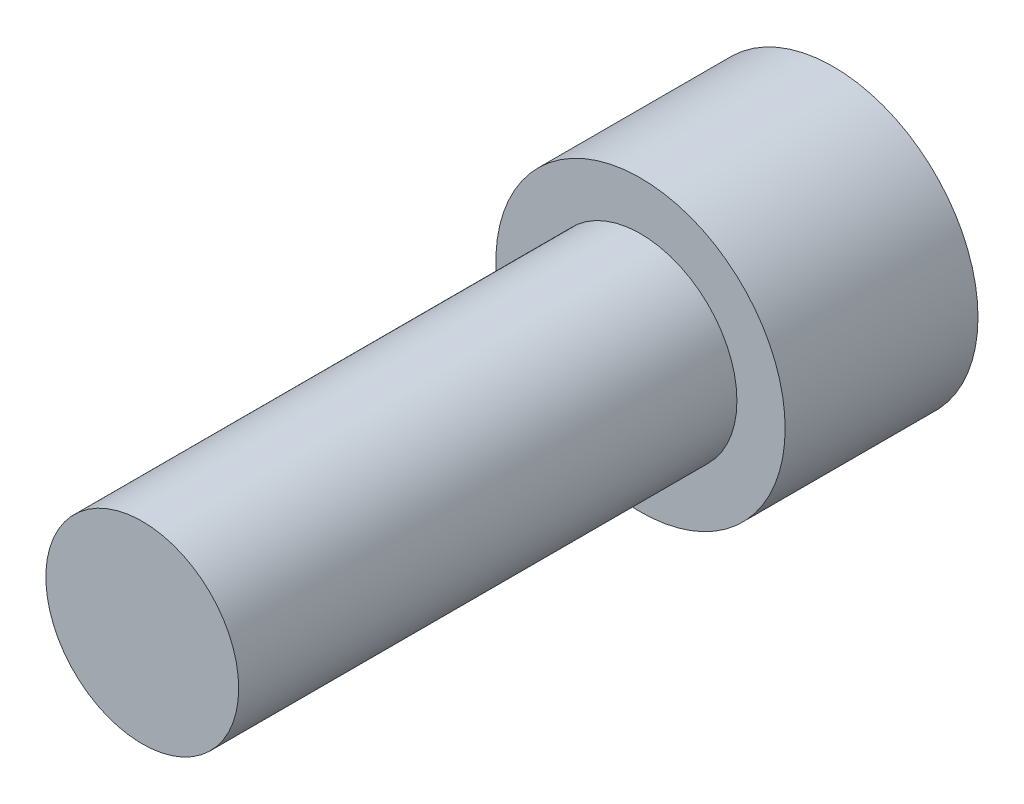
ISO-10303-21;
HEADER;
FILE_DESCRIPTION(('STEP AP214'),'2;1');
FILE_NAME('part.step','',(''),(''),'','','');
FILE_SCHEMA(('AUTOMOTIVE_DESIGN { 1 0 10303 214 1 1 1 1 }'));
ENDSEC;
DATA;
#1=APPLICATION_CONTEXT('core data for automotive mechanical design processes');
#2=APPLICATION_PROTOCOL_DEFINITION('international standard','automotive_design',2000,#1);
#3=PRODUCT_CONTEXT('',#1,'mechanical');
#4=PRODUCT('Part','Part','',(#3));
#5=PRODUCT_RELATED_PRODUCT_CATEGORY('part','',(#4));
#6=PRODUCT_DEFINITION_FORMATION('','',#4);
#7=PRODUCT_DEFINITION_CONTEXT('part definition',#1,'design');
#8=PRODUCT_DEFINITION('design','',#6,#7);
#9=PRODUCT_DEFINITION_SHAPE('','',#8);
#10=(LENGTH_UNIT() NAMED_UNIT(*) SI_UNIT(.MILLI.,.METRE.));
#11=(NAMED_UNIT(*) PLANE_ANGLE_UNIT() SI_UNIT($,.RADIAN.));
#12=(NAMED_UNIT(*) SI_UNIT($,.STERADIAN.) SOLID_ANGLE_UNIT());
#13=UNCERTAINTY_MEASURE_WITH_UNIT(LENGTH_MEASURE(1.E-05),#10,'distance_accuracy_value','');
#14=(GEOMETRIC_REPRESENTATION_CONTEXT(3) GLOBAL_UNCERTAINTY_ASSIGNED_CONTEXT((#13)) GLOBAL_UNIT_ASSIGNED_CONTEXT((#10,
#11,#12)) REPRESENTATION_CONTEXT('',''));
#15=CARTESIAN_POINT('',(0.,0.,0.));
#16=DIRECTION('',(0.,0.,1.));
#17=DIRECTION('',(1.,0.,0.));
#18=AXIS2_PLACEMENT_3D('',#15,#16,#17);
#19=CARTESIAN_POINT('',(0.,0.,12.));
#20=DIRECTION('',(0.,0.,1.));
#21=DIRECTION('',(1.,0.,0.));
#22=AXIS2_PLACEMENT_3D('',#19,#20,#21);
#23=PLANE('',#22);
#24=CARTESIAN_POINT('',(0.,0.,12.));
#25=DIRECTION('',(0.,0.,1.));
#26=DIRECTION('',(1.,0.,0.));
#27=AXIS2_PLACEMENT_3D('',#24,#25,#26);
#28=CIRCLE('',#27,9.);
#29=CARTESIAN_POINT('',(9.,0.,12.));
#30=VERTEX_POINT('',#29);
#31=EDGE_CURVE('E11',#30,#30,#28,.T.);
#32=ORIENTED_EDGE('',*,*,#31,.T.);
#33=EDGE_LOOP('',(#32));
#34=FACE_BOUND('',#33,.T.);
#35=CARTESIAN_POINT('',(0.,0.,12.));
#36=DIRECTION('',(0.,0.,1.));
#37=DIRECTION('',(1.,0.,0.));
#38=AXIS2_PLACEMENT_3D('',#35,#36,#37);
#39=CIRCLE('',#38,6.);
#40=CARTESIAN_POINT('',(6.,0.,12.));
#41=VERTEX_POINT('',#40);
#42=EDGE_CURVE('E139',#41,#41,#39,.T.);
#43=ORIENTED_EDGE('',*,*,#42,.F.);
#44=EDGE_LOOP('',(#43));
#45=FACE_BOUND('',#44,.T.);
#46=ADVANCED_FACE('F37',(#34,#45),#23,.T.);
#47=CARTESIAN_POINT('',(0.,0.,12.));
#48=DIRECTION('',(0.,0.,-1.));
#49=DIRECTION('',(-1.,0.,0.));
#50=AXIS2_PLACEMENT_3D('',#47,#48,#49);
#51=CYLINDRICAL_SURFACE('',#50,9.);
#52=ORIENTED_EDGE('',*,*,#31,.F.);
#53=EDGE_LOOP('',(#52));
#54=FACE_BOUND('',#53,.T.);
#55=CARTESIAN_POINT('',(0.,0.,0.));
#56=DIRECTION('',(0.,0.,1.));
#57=DIRECTION('',(1.,0.,0.));
#58=AXIS2_PLACEMENT_3D('',#55,#56,#57);
#59=CIRCLE('',#58,9.);
#60=CARTESIAN_POINT('',(9.,0.,0.));
#61=VERTEX_POINT('',#60);
#62=EDGE_CURVE('E41',#61,#61,#59,.T.);
#63=ORIENTED_EDGE('',*,*,#62,.T.);
#64=EDGE_LOOP('',(#63));
#65=FACE_BOUND('',#64,.T.);
#66=ADVANCED_FACE('F39',(#54,#65),#51,.T.);
#67=CARTESIAN_POINT('',(0.,0.,0.));
#68=DIRECTION('',(0.,0.,1.));
#69=DIRECTION('',(1.,0.,0.));
#70=AXIS2_PLACEMENT_3D('',#67,#68,#69);
#71=PLANE('',#70);
#72=DIRECTION('',(0.939506673027902,0.342530599123702,0.));
#73=VECTOR('',#72,1.);
#74=CARTESIAN_POINT('',(-5.21088849135358,4.3676326774003,0.));
#75=LINE('',#74,#73);
#76=CARTESIAN_POINT('',(-5.21088849135358,4.3676326774003,0.));
#77=VERTEX_POINT('',#76);
#78=CARTESIAN_POINT('',(1.17703660735091,6.69657814850032,0.));
#79=VERTEX_POINT('',#78);
#80=EDGE_CURVE('E126',#77,#79,#75,.T.);
#81=ORIENTED_EDGE('',*,*,#80,.F.);
#82=DIRECTION('',(0.173113136099322,0.984901945429015,0.));
#83=VECTOR('',#82,1.);
#84=CARTESIAN_POINT('',(-6.38792509870449,-2.32894547110002,0.));
#85=LINE('',#84,#83);
#86=CARTESIAN_POINT('',(-6.38792509870449,-2.32894547110002,0.));
#87=VERTEX_POINT('',#86);
#88=EDGE_CURVE('E52',#87,#77,#85,.T.);
#89=ORIENTED_EDGE('',*,*,#88,.F.);
#90=DIRECTION('',(-0.76639353692858,0.642371346305313,0.));
#91=VECTOR('',#90,1.);
#92=CARTESIAN_POINT('',(-1.17703660735091,-6.69657814850032,0.));
#93=LINE('',#92,#91);
#94=CARTESIAN_POINT('',(-1.17703660735091,-6.69657814850032,0.));
#95=VERTEX_POINT('',#94);
#96=EDGE_CURVE('E135',#95,#87,#93,.T.);
#97=ORIENTED_EDGE('',*,*,#96,.F.);
#98=DIRECTION('',(-0.939506673027902,-0.342530599123702,0.));
#99=VECTOR('',#98,1.);
#100=CARTESIAN_POINT('',(5.21088849135358,-4.3676326774003,0.));
#101=LINE('',#100,#99);
#102=CARTESIAN_POINT('',(5.21088849135358,-4.3676326774003,0.));
#103=VERTEX_POINT('',#102);
#104=EDGE_CURVE('E133',#103,#95,#101,.T.);
#105=ORIENTED_EDGE('',*,*,#104,.F.);
#106=DIRECTION('',(-0.173113136099322,-0.984901945429015,0.));
#107=VECTOR('',#106,1.);
#108=CARTESIAN_POINT('',(6.38792509870449,2.32894547110002,0.));
#109=LINE('',#108,#107);
#110=CARTESIAN_POINT('',(6.38792509870449,2.32894547110002,0.));
#111=VERTEX_POINT('',#110);
#112=EDGE_CURVE('E100',#111,#103,#109,.T.);
#113=ORIENTED_EDGE('',*,*,#112,.F.);
#114=DIRECTION('',(0.76639353692858,-0.642371346305313,0.));
#115=VECTOR('',#114,1.);
#116=CARTESIAN_POINT('',(1.17703660735091,6.69657814850032,0.));
#117=LINE('',#116,#115);
#118=EDGE_CURVE('E129',#79,#111,#117,.T.);
#119=ORIENTED_EDGE('',*,*,#118,.F.);
#120=EDGE_LOOP('',(#81,#89,#97,#105,#113,#119));
#121=FACE_BOUND('',#120,.T.);
#122=ORIENTED_EDGE('',*,*,#62,.F.);
#123=EDGE_LOOP('',(#122));
#124=FACE_BOUND('',#123,.T.);
#125=ADVANCED_FACE('F159',(#121,#124),#71,.F.);
#126=CARTESIAN_POINT('',(0.,0.,43.));
#127=DIRECTION('',(0.,0.,-1.));
#128=DIRECTION('',(-1.,0.,0.));
#129=AXIS2_PLACEMENT_3D('',#126,#127,#128);
#130=CYLINDRICAL_SURFACE('',#129,6.);
#131=CARTESIAN_POINT('',(0.,0.,43.));
#132=DIRECTION('',(0.,0.,1.));
#133=DIRECTION('',(1.,0.,0.));
#134=AXIS2_PLACEMENT_3D('',#131,#132,#133);
#135=CIRCLE('',#134,6.);
#136=CARTESIAN_POINT('',(6.,0.,43.));
#137=VERTEX_POINT('',#136);
#138=EDGE_CURVE('E145',#137,#137,#135,.T.);
#139=ORIENTED_EDGE('',*,*,#138,.F.);
#140=EDGE_LOOP('',(#139));
#141=FACE_BOUND('',#140,.T.);
#142=ORIENTED_EDGE('',*,*,#42,.T.);
#143=EDGE_LOOP('',(#142));
#144=FACE_BOUND('',#143,.T.);
#145=ADVANCED_FACE('F151',(#141,#144),#130,.T.);
#146=CARTESIAN_POINT('',(0.,0.,43.));
#147=DIRECTION('',(0.,0.,1.));
#148=DIRECTION('',(1.,0.,0.));
#149=AXIS2_PLACEMENT_3D('',#146,#147,#148);
#150=PLANE('',#149);
#151=ORIENTED_EDGE('',*,*,#138,.T.);
#152=EDGE_LOOP('',(#151));
#153=FACE_BOUND('',#152,.T.);
#154=ADVANCED_FACE('F168',(#153),#150,.T.);
#155=CARTESIAN_POINT('',(-6.38792509870449,-2.32894547110002,3.));
#156=DIRECTION('',(-0.984901945429015,0.173113136099322,0.));
#157=DIRECTION('',(-0.173113136099322,-0.984901945429015,0.));
#158=AXIS2_PLACEMENT_3D('',#155,#156,#157);
#159=PLANE('',#158);
#160=ORIENTED_EDGE('',*,*,#88,.T.);
#161=DIRECTION('',(0.,0.,-1.));
#162=VECTOR('',#161,1.);
#163=CARTESIAN_POINT('',(-5.21088849135358,4.3676326774003,3.));
#164=LINE('',#163,#162);
#165=CARTESIAN_POINT('',(-5.21088849135358,4.3676326774003,3.));
#166=VERTEX_POINT('',#165);
#167=EDGE_CURVE('E82',#166,#77,#164,.T.);
#168=ORIENTED_EDGE('',*,*,#167,.F.);
#169=DIRECTION('',(0.173113136099322,0.984901945429015,0.));
#170=VECTOR('',#169,1.);
#171=CARTESIAN_POINT('',(-6.38792509870449,-2.32894547110002,3.));
#172=LINE('',#171,#170);
#173=CARTESIAN_POINT('',(-6.38792509870449,-2.32894547110002,3.));
#174=VERTEX_POINT('',#173);
#175=EDGE_CURVE('E137',#174,#166,#172,.T.);
#176=ORIENTED_EDGE('',*,*,#175,.F.);
#177=DIRECTION('',(0.,0.,-1.));
#178=VECTOR('',#177,1.);
#179=CARTESIAN_POINT('',(-6.38792509870449,-2.32894547110002,3.));
#180=LINE('',#179,#178);
#181=EDGE_CURVE('E60',#174,#87,#180,.T.);
#182=ORIENTED_EDGE('',*,*,#181,.T.);
#183=EDGE_LOOP('',(#160,#168,#176,#182));
#184=FACE_BOUND('',#183,.T.);
#185=ADVANCED_FACE('F180',(#184),#159,.F.);
#186=CARTESIAN_POINT('',(-1.17703660735091,-6.69657814850032,3.));
#187=DIRECTION('',(-0.642371346305313,-0.76639353692858,0.));
#188=DIRECTION('',(0.76639353692858,-0.642371346305313,0.));
#189=AXIS2_PLACEMENT_3D('',#186,#187,#188);
#190=PLANE('',#189);
#191=ORIENTED_EDGE('',*,*,#96,.T.);
#192=ORIENTED_EDGE('',*,*,#181,.F.);
#193=DIRECTION('',(-0.76639353692858,0.642371346305313,0.));
#194=VECTOR('',#193,1.);
#195=CARTESIAN_POINT('',(-1.17703660735091,-6.69657814850032,3.));
#196=LINE('',#195,#194);
#197=CARTESIAN_POINT('',(-1.17703660735091,-6.69657814850032,3.));
#198=VERTEX_POINT('',#197);
#199=EDGE_CURVE('E112',#198,#174,#196,.T.);
#200=ORIENTED_EDGE('',*,*,#199,.F.);
#201=DIRECTION('',(0.,0.,-1.));
#202=VECTOR('',#201,1.);
#203=CARTESIAN_POINT('',(-1.17703660735091,-6.69657814850032,3.));
#204=LINE('',#203,#202);
#205=EDGE_CURVE('E104',#198,#95,#204,.T.);
#206=ORIENTED_EDGE('',*,*,#205,.T.);
#207=EDGE_LOOP('',(#191,#192,#200,#206));
#208=FACE_BOUND('',#207,.T.);
#209=ADVANCED_FACE('F182',(#208),#190,.F.);
#210=CARTESIAN_POINT('',(5.21088849135358,-4.3676326774003,3.));
#211=DIRECTION('',(0.342530599123702,-0.939506673027902,0.));
#212=DIRECTION('',(0.939506673027902,0.342530599123702,0.));
#213=AXIS2_PLACEMENT_3D('',#210,#211,#212);
#214=PLANE('',#213);
#215=ORIENTED_EDGE('',*,*,#104,.T.);
#216=ORIENTED_EDGE('',*,*,#205,.F.);
#217=DIRECTION('',(-0.939506673027902,-0.342530599123702,0.));
#218=VECTOR('',#217,1.);
#219=CARTESIAN_POINT('',(5.21088849135358,-4.3676326774003,3.));
#220=LINE('',#219,#218);
#221=CARTESIAN_POINT('',(5.21088849135358,-4.3676326774003,3.));
#222=VERTEX_POINT('',#221);
#223=EDGE_CURVE('E108',#222,#198,#220,.T.);
#224=ORIENTED_EDGE('',*,*,#223,.F.);
#225=DIRECTION('',(0.,0.,-1.));
#226=VECTOR('',#225,1.);
#227=CARTESIAN_POINT('',(5.21088849135358,-4.3676326774003,3.));
#228=LINE('',#227,#226);
#229=EDGE_CURVE('E93',#222,#103,#228,.T.);
#230=ORIENTED_EDGE('',*,*,#229,.T.);
#231=EDGE_LOOP('',(#215,#216,#224,#230));
#232=FACE_BOUND('',#231,.T.);
#233=ADVANCED_FACE('F109',(#232),#214,.F.);
#234=CARTESIAN_POINT('',(6.38792509870449,2.32894547110002,3.));
#235=DIRECTION('',(0.984901945429015,-0.173113136099322,0.));
#236=DIRECTION('',(0.173113136099322,0.984901945429015,0.));
#237=AXIS2_PLACEMENT_3D('',#234,#235,#236);
#238=PLANE('',#237);
#239=ORIENTED_EDGE('',*,*,#112,.T.);
#240=ORIENTED_EDGE('',*,*,#229,.F.);
#241=DIRECTION('',(-0.173113136099322,-0.984901945429015,0.));
#242=VECTOR('',#241,1.);
#243=CARTESIAN_POINT('',(6.38792509870449,2.32894547110002,3.));
#244=LINE('',#243,#242);
#245=CARTESIAN_POINT('',(6.38792509870449,2.32894547110002,3.));
#246=VERTEX_POINT('',#245);
#247=EDGE_CURVE('E97',#246,#222,#244,.T.);
#248=ORIENTED_EDGE('',*,*,#247,.F.);
#249=DIRECTION('',(0.,0.,-1.));
#250=VECTOR('',#249,1.);
#251=CARTESIAN_POINT('',(6.38792509870449,2.32894547110002,3.));
#252=LINE('',#251,#250);
#253=EDGE_CURVE('E105',#246,#111,#252,.T.);
#254=ORIENTED_EDGE('',*,*,#253,.T.);
#255=EDGE_LOOP('',(#239,#240,#248,#254));
#256=FACE_BOUND('',#255,.T.);
#257=ADVANCED_FACE('F95',(#256),#238,.F.);
#258=CARTESIAN_POINT('',(1.17703660735091,6.69657814850032,3.));
#259=DIRECTION('',(0.642371346305313,0.76639353692858,0.));
#260=DIRECTION('',(-0.76639353692858,0.642371346305313,0.));
#261=AXIS2_PLACEMENT_3D('',#258,#259,#260);
#262=PLANE('',#261);
#263=ORIENTED_EDGE('',*,*,#118,.T.);
#264=ORIENTED_EDGE('',*,*,#253,.F.);
#265=DIRECTION('',(0.76639353692858,-0.642371346305313,0.));
#266=VECTOR('',#265,1.);
#267=CARTESIAN_POINT('',(1.17703660735091,6.69657814850032,3.));
#268=LINE('',#267,#266);
#269=CARTESIAN_POINT('',(1.17703660735091,6.69657814850032,3.));
#270=VERTEX_POINT('',#269);
#271=EDGE_CURVE('E118',#270,#246,#268,.T.);
#272=ORIENTED_EDGE('',*,*,#271,.F.);
#273=DIRECTION('',(0.,0.,-1.));
#274=VECTOR('',#273,1.);
#275=CARTESIAN_POINT('',(1.17703660735091,6.69657814850032,3.));
#276=LINE('',#275,#274);
#277=EDGE_CURVE('E142',#270,#79,#276,.T.);
#278=ORIENTED_EDGE('',*,*,#277,.T.);
#279=EDGE_LOOP('',(#263,#264,#272,#278));
#280=FACE_BOUND('',#279,.T.);
#281=ADVANCED_FACE('F193',(#280),#262,.F.);
#282=CARTESIAN_POINT('',(-5.21088849135358,4.3676326774003,3.));
#283=DIRECTION('',(-0.342530599123702,0.939506673027902,0.));
#284=DIRECTION('',(-0.939506673027902,-0.342530599123702,0.));
#285=AXIS2_PLACEMENT_3D('',#282,#283,#284);
#286=PLANE('',#285);
#287=ORIENTED_EDGE('',*,*,#80,.T.);
#288=ORIENTED_EDGE('',*,*,#277,.F.);
#289=DIRECTION('',(0.939506673027902,0.342530599123702,0.));
#290=VECTOR('',#289,1.);
#291=CARTESIAN_POINT('',(-5.21088849135358,4.3676326774003,3.));
#292=LINE('',#291,#290);
#293=EDGE_CURVE('E120',#166,#270,#292,.T.);
#294=ORIENTED_EDGE('',*,*,#293,.F.);
#295=ORIENTED_EDGE('',*,*,#167,.T.);
#296=EDGE_LOOP('',(#287,#288,#294,#295));
#297=FACE_BOUND('',#296,.T.);
#298=ADVANCED_FACE('F178',(#297),#286,.F.);
#299=CARTESIAN_POINT('',(0.,0.,3.));
#300=DIRECTION('',(0.,0.,-1.));
#301=DIRECTION('',(-1.,0.,0.));
#302=AXIS2_PLACEMENT_3D('',#299,#300,#301);
#303=PLANE('',#302);
#304=ORIENTED_EDGE('',*,*,#175,.T.);
#305=ORIENTED_EDGE('',*,*,#293,.T.);
#306=ORIENTED_EDGE('',*,*,#271,.T.);
#307=ORIENTED_EDGE('',*,*,#247,.T.);
#308=ORIENTED_EDGE('',*,*,#223,.T.);
#309=ORIENTED_EDGE('',*,*,#199,.T.);
#310=EDGE_LOOP('',(#304,#305,#306,#307,#308,#309));
#311=FACE_BOUND('',#310,.T.);
#312=ADVANCED_FACE('F115',(#311),#303,.T.);
#313=CLOSED_SHELL('',(#46,#66,#125,#145,#154,#185,#209,#233,#257,#281,#298,#312));
#314=MANIFOLD_SOLID_BREP('B2',#313);
#315=ADVANCED_BREP_SHAPE_REPRESENTATION('',(#18,#314),#14);
#316=SHAPE_DEFINITION_REPRESENTATION(#9,#315);
ENDSEC;
END-ISO-10303-21;
